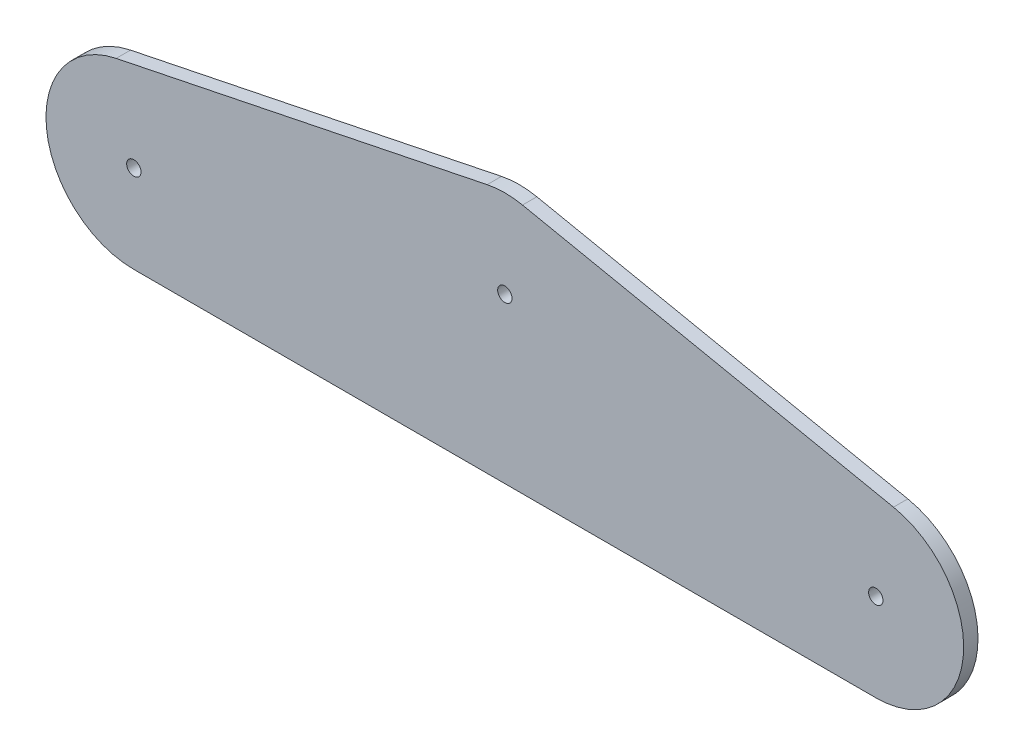
ISO-10303-21;
HEADER;
FILE_DESCRIPTION(('STEP AP214'),'2;1');
FILE_NAME('part.step','',(''),(''),'','','');
FILE_SCHEMA(('AUTOMOTIVE_DESIGN { 1 0 10303 214 1 1 1 1 }'));
ENDSEC;
DATA;
#1=APPLICATION_CONTEXT('core data for automotive mechanical design processes');
#2=APPLICATION_PROTOCOL_DEFINITION('international standard','automotive_design',2000,#1);
#3=PRODUCT_CONTEXT('',#1,'mechanical');
#4=PRODUCT('Part','Part','',(#3));
#5=PRODUCT_RELATED_PRODUCT_CATEGORY('part','',(#4));
#6=PRODUCT_DEFINITION_FORMATION('','',#4);
#7=PRODUCT_DEFINITION_CONTEXT('part definition',#1,'design');
#8=PRODUCT_DEFINITION('design','',#6,#7);
#9=PRODUCT_DEFINITION_SHAPE('','',#8);
#10=(LENGTH_UNIT() NAMED_UNIT(*) SI_UNIT(.MILLI.,.METRE.));
#11=(NAMED_UNIT(*) PLANE_ANGLE_UNIT() SI_UNIT($,.RADIAN.));
#12=(NAMED_UNIT(*) SI_UNIT($,.STERADIAN.) SOLID_ANGLE_UNIT());
#13=UNCERTAINTY_MEASURE_WITH_UNIT(LENGTH_MEASURE(1.E-05),#10,'distance_accuracy_value','');
#14=(GEOMETRIC_REPRESENTATION_CONTEXT(3) GLOBAL_UNCERTAINTY_ASSIGNED_CONTEXT((#13)) GLOBAL_UNIT_ASSIGNED_CONTEXT((#10,
#11,#12)) REPRESENTATION_CONTEXT('',''));
#15=CARTESIAN_POINT('',(0.,0.,0.));
#16=DIRECTION('',(0.,0.,1.));
#17=DIRECTION('',(1.,0.,0.));
#18=AXIS2_PLACEMENT_3D('',#15,#16,#17);
#19=CARTESIAN_POINT('',(74.1594982744302,56.692139380853,6.223));
#20=DIRECTION('',(-0.201071000711914,-0.979576670134967,0.));
#21=DIRECTION('',(0.979576670134967,-0.201071000711914,0.));
#22=AXIS2_PLACEMENT_3D('',#19,#20,#21);
#23=PLANE('',#22);
#24=DIRECTION('',(-0.979576670134967,0.201071000711914,0.));
#25=VECTOR('',#24,1.);
#26=CARTESIAN_POINT('',(74.1594982744302,56.692139380853,0.));
#27=LINE('',#26,#25);
#28=CARTESIAN_POINT('',(168.527471793791,37.3218711321422,0.));
#29=VERTEX_POINT('',#28);
#30=CARTESIAN_POINT('',(7.66080512712394,70.3418711321422,0.));
#31=VERTEX_POINT('',#30);
#32=EDGE_CURVE('E127',#29,#31,#27,.T.);
#33=ORIENTED_EDGE('',*,*,#32,.T.);
#34=DIRECTION('',(0.,0.,-1.));
#35=VECTOR('',#34,1.);
#36=CARTESIAN_POINT('',(7.66080512712394,70.3418711321422,6.223));
#37=LINE('',#36,#35);
#38=CARTESIAN_POINT('',(7.66080512712394,70.3418711321422,6.223));
#39=VERTEX_POINT('',#38);
#40=EDGE_CURVE('E11',#39,#31,#37,.T.);
#41=ORIENTED_EDGE('',*,*,#40,.F.);
#42=DIRECTION('',(-0.979576670134967,0.201071000711914,0.));
#43=VECTOR('',#42,1.);
#44=CARTESIAN_POINT('',(74.1594982744302,56.692139380853,6.223));
#45=LINE('',#44,#43);
#46=CARTESIAN_POINT('',(168.527471793791,37.3218711321422,6.223));
#47=VERTEX_POINT('',#46);
#48=EDGE_CURVE('E150',#47,#39,#45,.T.);
#49=ORIENTED_EDGE('',*,*,#48,.F.);
#50=DIRECTION('',(0.,0.,-1.));
#51=VECTOR('',#50,1.);
#52=CARTESIAN_POINT('',(168.527471793791,37.3218711321422,6.223));
#53=LINE('',#52,#51);
#54=EDGE_CURVE('E49',#47,#29,#53,.T.);
#55=ORIENTED_EDGE('',*,*,#54,.T.);
#56=EDGE_LOOP('',(#33,#41,#49,#55));
#57=FACE_BOUND('',#56,.T.);
#58=ADVANCED_FACE('F33',(#57),#23,.F.);
#59=CARTESIAN_POINT('',(0.,33.02,6.223));
#60=DIRECTION('',(0.,0.,-1.));
#61=DIRECTION('',(-1.,0.,0.));
#62=AXIS2_PLACEMENT_3D('',#59,#60,#61);
#63=CYLINDRICAL_SURFACE('',#62,38.1);
#64=CARTESIAN_POINT('',(0.,33.02,0.));
#65=DIRECTION('',(0.,0.,1.));
#66=DIRECTION('',(1.,0.,0.));
#67=AXIS2_PLACEMENT_3D('',#64,#65,#66);
#68=CIRCLE('',#67,38.1);
#69=CARTESIAN_POINT('',(-7.66080512712394,70.3418711321422,0.));
#70=VERTEX_POINT('',#69);
#71=EDGE_CURVE('E129',#31,#70,#68,.T.);
#72=ORIENTED_EDGE('',*,*,#71,.T.);
#73=DIRECTION('',(0.,0.,-1.));
#74=VECTOR('',#73,1.);
#75=CARTESIAN_POINT('',(-7.66080512712394,70.3418711321422,6.223));
#76=LINE('',#75,#74);
#77=CARTESIAN_POINT('',(-7.66080512712394,70.3418711321422,6.223));
#78=VERTEX_POINT('',#77);
#79=EDGE_CURVE('E41',#78,#70,#76,.T.);
#80=ORIENTED_EDGE('',*,*,#79,.F.);
#81=CARTESIAN_POINT('',(0.,33.02,6.223));
#82=DIRECTION('',(0.,0.,1.));
#83=DIRECTION('',(1.,0.,0.));
#84=AXIS2_PLACEMENT_3D('',#81,#82,#83);
#85=CIRCLE('',#84,38.1);
#86=EDGE_CURVE('E82',#39,#78,#85,.T.);
#87=ORIENTED_EDGE('',*,*,#86,.F.);
#88=ORIENTED_EDGE('',*,*,#40,.T.);
#89=EDGE_LOOP('',(#72,#80,#87,#88));
#90=FACE_BOUND('',#89,.T.);
#91=ADVANCED_FACE('F156',(#90),#63,.T.);
#92=CARTESIAN_POINT('',(-74.1594982744302,56.692139380853,6.223));
#93=DIRECTION('',(-0.201071000711914,0.979576670134967,0.));
#94=DIRECTION('',(-0.979576670134967,-0.201071000711914,0.));
#95=AXIS2_PLACEMENT_3D('',#92,#93,#94);
#96=PLANE('',#95);
#97=DIRECTION('',(0.979576670134967,0.201071000711914,0.));
#98=VECTOR('',#97,1.);
#99=CARTESIAN_POINT('',(-74.1594982744302,56.692139380853,0.));
#100=LINE('',#99,#98);
#101=CARTESIAN_POINT('',(-168.527471793791,37.3218711321422,0.));
#102=VERTEX_POINT('',#101);
#103=EDGE_CURVE('E132',#102,#70,#100,.T.);
#104=ORIENTED_EDGE('',*,*,#103,.F.);
#105=DIRECTION('',(0.,0.,-1.));
#106=VECTOR('',#105,1.);
#107=CARTESIAN_POINT('',(-168.527471793791,37.3218711321422,6.223));
#108=LINE('',#107,#106);
#109=CARTESIAN_POINT('',(-168.527471793791,37.3218711321422,6.223));
#110=VERTEX_POINT('',#109);
#111=EDGE_CURVE('E110',#110,#102,#108,.T.);
#112=ORIENTED_EDGE('',*,*,#111,.F.);
#113=DIRECTION('',(0.979576670134967,0.201071000711914,0.));
#114=VECTOR('',#113,1.);
#115=CARTESIAN_POINT('',(-74.1594982744302,56.692139380853,6.223));
#116=LINE('',#115,#114);
#117=EDGE_CURVE('E100',#110,#78,#116,.T.);
#118=ORIENTED_EDGE('',*,*,#117,.T.);
#119=ORIENTED_EDGE('',*,*,#79,.T.);
#120=EDGE_LOOP('',(#104,#112,#118,#119));
#121=FACE_BOUND('',#120,.T.);
#122=ADVANCED_FACE('F155',(#121),#96,.T.);
#123=CARTESIAN_POINT('',(-160.866666666667,0.,6.223));
#124=DIRECTION('',(0.,0.,-1.));
#125=DIRECTION('',(-1.,0.,0.));
#126=AXIS2_PLACEMENT_3D('',#123,#124,#125);
#127=CYLINDRICAL_SURFACE('',#126,38.1);
#128=CARTESIAN_POINT('',(-160.866666666667,0.,0.));
#129=DIRECTION('',(0.,0.,1.));
#130=DIRECTION('',(1.,0.,0.));
#131=AXIS2_PLACEMENT_3D('',#128,#129,#130);
#132=CIRCLE('',#131,38.1);
#133=CARTESIAN_POINT('',(-160.866666666667,-38.1,0.));
#134=VERTEX_POINT('',#133);
#135=EDGE_CURVE('E107',#102,#134,#132,.T.);
#136=ORIENTED_EDGE('',*,*,#135,.T.);
#137=DIRECTION('',(0.,0.,-1.));
#138=VECTOR('',#137,1.);
#139=CARTESIAN_POINT('',(-160.866666666667,-38.1,6.223));
#140=LINE('',#139,#138);
#141=CARTESIAN_POINT('',(-160.866666666667,-38.1,6.223));
#142=VERTEX_POINT('',#141);
#143=EDGE_CURVE('E104',#142,#134,#140,.T.);
#144=ORIENTED_EDGE('',*,*,#143,.F.);
#145=CARTESIAN_POINT('',(-160.866666666667,0.,6.223));
#146=DIRECTION('',(0.,0.,1.));
#147=DIRECTION('',(1.,0.,0.));
#148=AXIS2_PLACEMENT_3D('',#145,#146,#147);
#149=CIRCLE('',#148,38.1);
#150=EDGE_CURVE('E92',#110,#142,#149,.T.);
#151=ORIENTED_EDGE('',*,*,#150,.F.);
#152=ORIENTED_EDGE('',*,*,#111,.T.);
#153=EDGE_LOOP('',(#136,#144,#151,#152));
#154=FACE_BOUND('',#153,.T.);
#155=ADVANCED_FACE('F105',(#154),#127,.T.);
#156=CARTESIAN_POINT('',(0.,-38.1,6.223));
#157=DIRECTION('',(0.,1.,0.));
#158=DIRECTION('',(0.,0.,1.));
#159=AXIS2_PLACEMENT_3D('',#156,#157,#158);
#160=PLANE('',#159);
#161=DIRECTION('',(1.,0.,0.));
#162=VECTOR('',#161,1.);
#163=CARTESIAN_POINT('',(0.,-38.1,0.));
#164=LINE('',#163,#162);
#165=CARTESIAN_POINT('',(160.866666666667,-38.1,0.));
#166=VERTEX_POINT('',#165);
#167=EDGE_CURVE('E136',#134,#166,#164,.T.);
#168=ORIENTED_EDGE('',*,*,#167,.T.);
#169=DIRECTION('',(0.,0.,-1.));
#170=VECTOR('',#169,1.);
#171=CARTESIAN_POINT('',(160.866666666667,-38.1,6.223));
#172=LINE('',#171,#170);
#173=CARTESIAN_POINT('',(160.866666666667,-38.1,6.223));
#174=VERTEX_POINT('',#173);
#175=EDGE_CURVE('E70',#174,#166,#172,.T.);
#176=ORIENTED_EDGE('',*,*,#175,.F.);
#177=DIRECTION('',(1.,0.,0.));
#178=VECTOR('',#177,1.);
#179=CARTESIAN_POINT('',(0.,-38.1,6.223));
#180=LINE('',#179,#178);
#181=EDGE_CURVE('E98',#142,#174,#180,.T.);
#182=ORIENTED_EDGE('',*,*,#181,.F.);
#183=ORIENTED_EDGE('',*,*,#143,.T.);
#184=EDGE_LOOP('',(#168,#176,#182,#183));
#185=FACE_BOUND('',#184,.T.);
#186=ADVANCED_FACE('F112',(#185),#160,.F.);
#187=CARTESIAN_POINT('',(-160.866666666667,0.,6.223));
#188=DIRECTION('',(0.,0.,-1.));
#189=DIRECTION('',(-1.,0.,0.));
#190=AXIS2_PLACEMENT_3D('',#187,#188,#189);
#191=CYLINDRICAL_SURFACE('',#190,3.11149999999999);
#192=CARTESIAN_POINT('',(-160.866666666667,0.,6.223));
#193=DIRECTION('',(0.,0.,1.));
#194=DIRECTION('',(1.,0.,0.));
#195=AXIS2_PLACEMENT_3D('',#192,#193,#194);
#196=CIRCLE('',#195,3.11149999999999);
#197=CARTESIAN_POINT('',(-157.755166666667,0.,6.223));
#198=VERTEX_POINT('',#197);
#199=EDGE_CURVE('E121',#198,#198,#196,.T.);
#200=ORIENTED_EDGE('',*,*,#199,.T.);
#201=EDGE_LOOP('',(#200));
#202=FACE_BOUND('',#201,.T.);
#203=CARTESIAN_POINT('',(-160.866666666667,0.,0.));
#204=DIRECTION('',(0.,0.,1.));
#205=DIRECTION('',(1.,0.,0.));
#206=AXIS2_PLACEMENT_3D('',#203,#204,#205);
#207=CIRCLE('',#206,3.11149999999999);
#208=CARTESIAN_POINT('',(-157.755166666667,0.,0.));
#209=VERTEX_POINT('',#208);
#210=EDGE_CURVE('E144',#209,#209,#207,.T.);
#211=ORIENTED_EDGE('',*,*,#210,.F.);
#212=EDGE_LOOP('',(#211));
#213=FACE_BOUND('',#212,.T.);
#214=ADVANCED_FACE('F172',(#202,#213),#191,.F.);
#215=CARTESIAN_POINT('',(0.,33.02,6.223));
#216=DIRECTION('',(0.,0.,-1.));
#217=DIRECTION('',(-1.,0.,0.));
#218=AXIS2_PLACEMENT_3D('',#215,#216,#217);
#219=CYLINDRICAL_SURFACE('',#218,3.1115);
#220=CARTESIAN_POINT('',(0.,33.02,6.223));
#221=DIRECTION('',(0.,0.,1.));
#222=DIRECTION('',(1.,0.,0.));
#223=AXIS2_PLACEMENT_3D('',#220,#221,#222);
#224=CIRCLE('',#223,3.1115);
#225=CARTESIAN_POINT('',(3.1115,33.02,6.223));
#226=VERTEX_POINT('',#225);
#227=EDGE_CURVE('E115',#226,#226,#224,.T.);
#228=ORIENTED_EDGE('',*,*,#227,.T.);
#229=EDGE_LOOP('',(#228));
#230=FACE_BOUND('',#229,.T.);
#231=CARTESIAN_POINT('',(0.,33.02,0.));
#232=DIRECTION('',(0.,0.,1.));
#233=DIRECTION('',(1.,0.,0.));
#234=AXIS2_PLACEMENT_3D('',#231,#232,#233);
#235=CIRCLE('',#234,3.1115);
#236=CARTESIAN_POINT('',(3.1115,33.02,0.));
#237=VERTEX_POINT('',#236);
#238=EDGE_CURVE('E141',#237,#237,#235,.T.);
#239=ORIENTED_EDGE('',*,*,#238,.F.);
#240=EDGE_LOOP('',(#239));
#241=FACE_BOUND('',#240,.T.);
#242=ADVANCED_FACE('F164',(#230,#241),#219,.F.);
#243=CARTESIAN_POINT('',(160.866666666667,0.,6.223));
#244=DIRECTION('',(0.,0.,-1.));
#245=DIRECTION('',(-1.,0.,0.));
#246=AXIS2_PLACEMENT_3D('',#243,#244,#245);
#247=CYLINDRICAL_SURFACE('',#246,38.1);
#248=CARTESIAN_POINT('',(160.866666666667,0.,0.));
#249=DIRECTION('',(0.,0.,1.));
#250=DIRECTION('',(1.,0.,0.));
#251=AXIS2_PLACEMENT_3D('',#248,#249,#250);
#252=CIRCLE('',#251,38.1);
#253=EDGE_CURVE('E138',#29,#166,#252,.F.);
#254=ORIENTED_EDGE('',*,*,#253,.F.);
#255=ORIENTED_EDGE('',*,*,#54,.F.);
#256=CARTESIAN_POINT('',(160.866666666667,0.,6.223));
#257=DIRECTION('',(0.,0.,1.));
#258=DIRECTION('',(1.,0.,0.));
#259=AXIS2_PLACEMENT_3D('',#256,#257,#258);
#260=CIRCLE('',#259,38.1);
#261=EDGE_CURVE('E113',#47,#174,#260,.F.);
#262=ORIENTED_EDGE('',*,*,#261,.T.);
#263=ORIENTED_EDGE('',*,*,#175,.T.);
#264=EDGE_LOOP('',(#254,#255,#262,#263));
#265=FACE_BOUND('',#264,.T.);
#266=ADVANCED_FACE('F161',(#265),#247,.T.);
#267=CARTESIAN_POINT('',(160.866666666667,0.,6.223));
#268=DIRECTION('',(0.,0.,-1.));
#269=DIRECTION('',(-1.,0.,0.));
#270=AXIS2_PLACEMENT_3D('',#267,#268,#269);
#271=CYLINDRICAL_SURFACE('',#270,3.11149999999999);
#272=CARTESIAN_POINT('',(160.866666666667,0.,6.223));
#273=DIRECTION('',(0.,0.,1.));
#274=DIRECTION('',(1.,0.,0.));
#275=AXIS2_PLACEMENT_3D('',#272,#273,#274);
#276=CIRCLE('',#275,3.11149999999999);
#277=CARTESIAN_POINT('',(163.978166666667,0.,6.223));
#278=VERTEX_POINT('',#277);
#279=EDGE_CURVE('E124',#278,#278,#276,.F.);
#280=ORIENTED_EDGE('',*,*,#279,.F.);
#281=EDGE_LOOP('',(#280));
#282=FACE_BOUND('',#281,.T.);
#283=CARTESIAN_POINT('',(160.866666666667,0.,0.));
#284=DIRECTION('',(0.,0.,1.));
#285=DIRECTION('',(1.,0.,0.));
#286=AXIS2_PLACEMENT_3D('',#283,#284,#285);
#287=CIRCLE('',#286,3.11149999999999);
#288=CARTESIAN_POINT('',(163.978166666667,0.,0.));
#289=VERTEX_POINT('',#288);
#290=EDGE_CURVE('E147',#289,#289,#287,.F.);
#291=ORIENTED_EDGE('',*,*,#290,.T.);
#292=EDGE_LOOP('',(#291));
#293=FACE_BOUND('',#292,.T.);
#294=ADVANCED_FACE('F163',(#282,#293),#271,.F.);
#295=CARTESIAN_POINT('',(0.,-304.597724007397,6.223));
#296=DIRECTION('',(0.,0.,1.));
#297=DIRECTION('',(1.,0.,0.));
#298=AXIS2_PLACEMENT_3D('',#295,#296,#297);
#299=PLANE('',#298);
#300=ORIENTED_EDGE('',*,*,#48,.T.);
#301=ORIENTED_EDGE('',*,*,#86,.T.);
#302=ORIENTED_EDGE('',*,*,#117,.F.);
#303=ORIENTED_EDGE('',*,*,#150,.T.);
#304=ORIENTED_EDGE('',*,*,#181,.T.);
#305=ORIENTED_EDGE('',*,*,#261,.F.);
#306=EDGE_LOOP('',(#300,#301,#302,#303,#304,#305));
#307=FACE_BOUND('',#306,.T.);
#308=ORIENTED_EDGE('',*,*,#227,.F.);
#309=EDGE_LOOP('',(#308));
#310=FACE_BOUND('',#309,.T.);
#311=ORIENTED_EDGE('',*,*,#199,.F.);
#312=EDGE_LOOP('',(#311));
#313=FACE_BOUND('',#312,.T.);
#314=ORIENTED_EDGE('',*,*,#279,.T.);
#315=EDGE_LOOP('',(#314));
#316=FACE_BOUND('',#315,.T.);
#317=ADVANCED_FACE('F94',(#307,#310,#313,#316),#299,.T.);
#318=CARTESIAN_POINT('',(0.,-304.597724007397,0.));
#319=DIRECTION('',(0.,0.,1.));
#320=DIRECTION('',(1.,0.,0.));
#321=AXIS2_PLACEMENT_3D('',#318,#319,#320);
#322=PLANE('',#321);
#323=ORIENTED_EDGE('',*,*,#32,.F.);
#324=ORIENTED_EDGE('',*,*,#253,.T.);
#325=ORIENTED_EDGE('',*,*,#167,.F.);
#326=ORIENTED_EDGE('',*,*,#135,.F.);
#327=ORIENTED_EDGE('',*,*,#103,.T.);
#328=ORIENTED_EDGE('',*,*,#71,.F.);
#329=EDGE_LOOP('',(#323,#324,#325,#326,#327,#328));
#330=FACE_BOUND('',#329,.T.);
#331=ORIENTED_EDGE('',*,*,#238,.T.);
#332=EDGE_LOOP('',(#331));
#333=FACE_BOUND('',#332,.T.);
#334=ORIENTED_EDGE('',*,*,#210,.T.);
#335=EDGE_LOOP('',(#334));
#336=FACE_BOUND('',#335,.T.);
#337=ORIENTED_EDGE('',*,*,#290,.F.);
#338=EDGE_LOOP('',(#337));
#339=FACE_BOUND('',#338,.T.);
#340=ADVANCED_FACE('F159',(#330,#333,#336,#339),#322,.F.);
#341=CLOSED_SHELL('',(#58,#91,#122,#155,#186,#214,#242,#266,#294,#317,#340));
#342=MANIFOLD_SOLID_BREP('B2',#341);
#343=ADVANCED_BREP_SHAPE_REPRESENTATION('',(#18,#342),#14);
#344=SHAPE_DEFINITION_REPRESENTATION(#9,#343);
ENDSEC;
END-ISO-10303-21;
